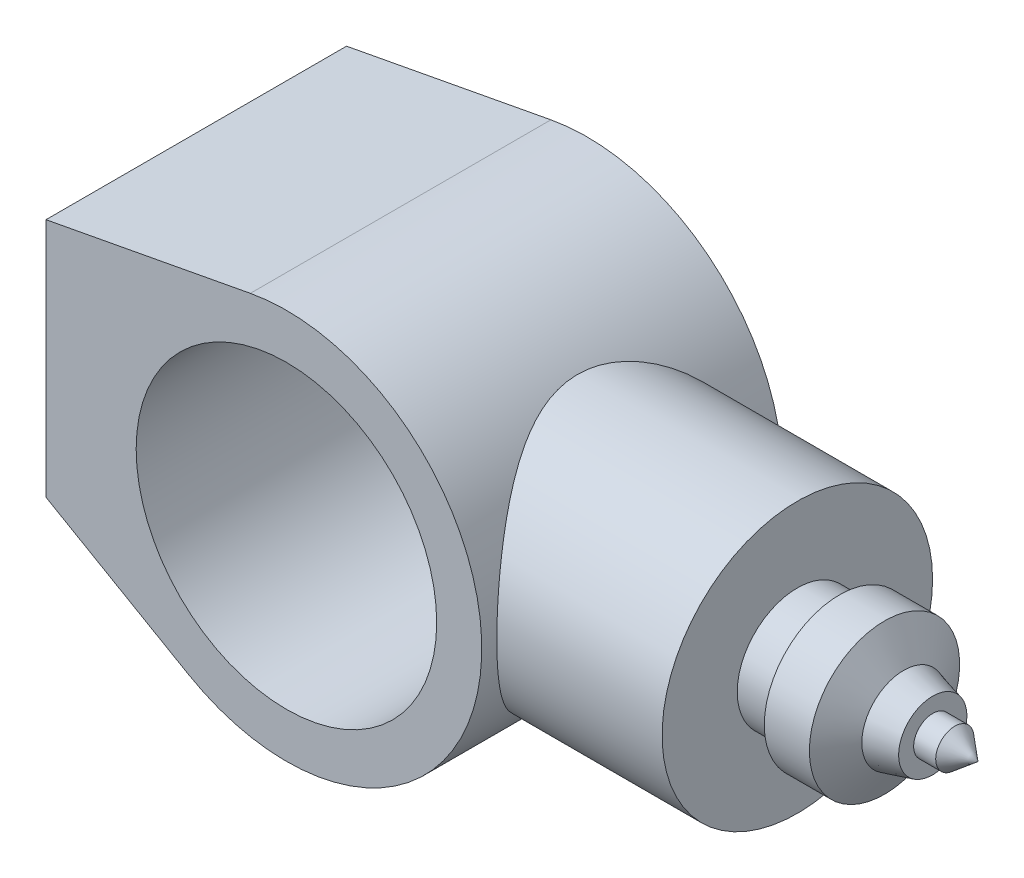
ISO-10303-21;
HEADER;
FILE_DESCRIPTION(('STEP AP214'),'2;1');
FILE_NAME('part.step','',(''),(''),'','','');
FILE_SCHEMA(('AUTOMOTIVE_DESIGN { 1 0 10303 214 1 1 1 1 }'));
ENDSEC;
DATA;
#1=APPLICATION_CONTEXT('core data for automotive mechanical design processes');
#2=APPLICATION_PROTOCOL_DEFINITION('international standard','automotive_design',2000,#1);
#3=PRODUCT_CONTEXT('',#1,'mechanical');
#4=PRODUCT('Part','Part','',(#3));
#5=PRODUCT_RELATED_PRODUCT_CATEGORY('part','',(#4));
#6=PRODUCT_DEFINITION_FORMATION('','',#4);
#7=PRODUCT_DEFINITION_CONTEXT('part definition',#1,'design');
#8=PRODUCT_DEFINITION('design','',#6,#7);
#9=PRODUCT_DEFINITION_SHAPE('','',#8);
#10=(LENGTH_UNIT() NAMED_UNIT(*) SI_UNIT(.MILLI.,.METRE.));
#11=(NAMED_UNIT(*) PLANE_ANGLE_UNIT() SI_UNIT($,.RADIAN.));
#12=(NAMED_UNIT(*) SI_UNIT($,.STERADIAN.) SOLID_ANGLE_UNIT());
#13=UNCERTAINTY_MEASURE_WITH_UNIT(LENGTH_MEASURE(1.E-05),#10,'distance_accuracy_value','');
#14=(GEOMETRIC_REPRESENTATION_CONTEXT(3) GLOBAL_UNCERTAINTY_ASSIGNED_CONTEXT((#13)) GLOBAL_UNIT_ASSIGNED_CONTEXT((#10,
#11,#12)) REPRESENTATION_CONTEXT('',''));
#15=CARTESIAN_POINT('',(0.,0.,0.));
#16=DIRECTION('',(0.,0.,1.));
#17=DIRECTION('',(1.,0.,0.));
#18=AXIS2_PLACEMENT_3D('',#15,#16,#17);
#19=CARTESIAN_POINT('',(0.,0.,50.));
#20=DIRECTION('',(0.,0.,1.));
#21=DIRECTION('',(1.,0.,0.));
#22=AXIS2_PLACEMENT_3D('',#19,#20,#21);
#23=PLANE('',#22);
#24=CARTESIAN_POINT('',(0.,0.,50.));
#25=DIRECTION('',(0.,0.,1.));
#26=DIRECTION('',(1.,0.,0.));
#27=AXIS2_PLACEMENT_3D('',#24,#25,#26);
#28=CIRCLE('',#27,65.);
#29=CARTESIAN_POINT('',(-32.4793847127573,-56.3035484554988,50.));
#30=VERTEX_POINT('',#29);
#31=CARTESIAN_POINT('',(-12.,63.8827050147378,50.));
#32=VERTEX_POINT('',#31);
#33=EDGE_CURVE('E207',#30,#32,#28,.T.);
#34=ORIENTED_EDGE('',*,*,#33,.T.);
#35=DIRECTION('',(-0.982810846380581,-0.184615384615384,0.));
#36=VECTOR('',#35,1.);
#37=CARTESIAN_POINT('',(-80.,51.1092947496003,50.));
#38=LINE('',#37,#36);
#39=CARTESIAN_POINT('',(-80.,51.1092947496003,50.));
#40=VERTEX_POINT('',#39);
#41=EDGE_CURVE('E89',#32,#40,#38,.T.);
#42=ORIENTED_EDGE('',*,*,#41,.T.);
#43=DIRECTION('',(0.,-1.,0.));
#44=VECTOR('',#43,1.);
#45=CARTESIAN_POINT('',(-80.,-28.8907052503997,50.));
#46=LINE('',#45,#44);
#47=CARTESIAN_POINT('',(-80.,-28.8907052503997,50.));
#48=VERTEX_POINT('',#47);
#49=EDGE_CURVE('E199',#40,#48,#46,.T.);
#50=ORIENTED_EDGE('',*,*,#49,.T.);
#51=DIRECTION('',(0.866208437776906,-0.499682841734728,0.));
#52=VECTOR('',#51,1.);
#53=CARTESIAN_POINT('',(-80.,-28.8907052503997,50.));
#54=LINE('',#53,#52);
#55=EDGE_CURVE('E58',#48,#30,#54,.T.);
#56=ORIENTED_EDGE('',*,*,#55,.T.);
#57=EDGE_LOOP('',(#34,#42,#50,#56));
#58=FACE_BOUND('',#57,.T.);
#59=CARTESIAN_POINT('',(0.,0.,50.));
#60=DIRECTION('',(0.,0.,1.));
#61=DIRECTION('',(1.,0.,0.));
#62=AXIS2_PLACEMENT_3D('',#59,#60,#61);
#63=CIRCLE('',#62,50.);
#64=CARTESIAN_POINT('',(50.,0.,50.));
#65=VERTEX_POINT('',#64);
#66=EDGE_CURVE('E130',#65,#65,#63,.T.);
#67=ORIENTED_EDGE('',*,*,#66,.F.);
#68=EDGE_LOOP('',(#67));
#69=FACE_BOUND('',#68,.T.);
#70=ADVANCED_FACE('F40',(#58,#69),#23,.T.);
#71=CARTESIAN_POINT('',(0.,0.,-50.));
#72=DIRECTION('',(0.,0.,1.));
#73=DIRECTION('',(1.,0.,0.));
#74=AXIS2_PLACEMENT_3D('',#71,#72,#73);
#75=PLANE('',#74);
#76=CARTESIAN_POINT('',(0.,0.,-50.));
#77=DIRECTION('',(0.,0.,1.));
#78=DIRECTION('',(1.,0.,0.));
#79=AXIS2_PLACEMENT_3D('',#76,#77,#78);
#80=CIRCLE('',#79,65.);
#81=CARTESIAN_POINT('',(-32.4793847127573,-56.3035484554988,-50.));
#82=VERTEX_POINT('',#81);
#83=CARTESIAN_POINT('',(-12.,63.8827050147378,-50.));
#84=VERTEX_POINT('',#83);
#85=EDGE_CURVE('E197',#82,#84,#80,.T.);
#86=ORIENTED_EDGE('',*,*,#85,.F.);
#87=DIRECTION('',(0.866208437776906,-0.499682841734728,0.));
#88=VECTOR('',#87,1.);
#89=CARTESIAN_POINT('',(-80.,-28.8907052503997,-50.));
#90=LINE('',#89,#88);
#91=CARTESIAN_POINT('',(-80.,-28.8907052503997,-50.));
#92=VERTEX_POINT('',#91);
#93=EDGE_CURVE('E82',#92,#82,#90,.T.);
#94=ORIENTED_EDGE('',*,*,#93,.F.);
#95=DIRECTION('',(0.,-1.,0.));
#96=VECTOR('',#95,1.);
#97=CARTESIAN_POINT('',(-80.,-28.8907052503997,-50.));
#98=LINE('',#97,#96);
#99=CARTESIAN_POINT('',(-80.,51.1092947496003,-50.));
#100=VERTEX_POINT('',#99);
#101=EDGE_CURVE('E76',#100,#92,#98,.T.);
#102=ORIENTED_EDGE('',*,*,#101,.F.);
#103=DIRECTION('',(-0.982810846380581,-0.184615384615384,0.));
#104=VECTOR('',#103,1.);
#105=CARTESIAN_POINT('',(-80.,51.1092947496003,-50.));
#106=LINE('',#105,#104);
#107=EDGE_CURVE('E191',#84,#100,#106,.T.);
#108=ORIENTED_EDGE('',*,*,#107,.F.);
#109=EDGE_LOOP('',(#86,#94,#102,#108));
#110=FACE_BOUND('',#109,.T.);
#111=CARTESIAN_POINT('',(0.,0.,-50.));
#112=DIRECTION('',(0.,0.,1.));
#113=DIRECTION('',(1.,0.,0.));
#114=AXIS2_PLACEMENT_3D('',#111,#112,#113);
#115=CIRCLE('',#114,50.);
#116=CARTESIAN_POINT('',(50.,0.,-50.));
#117=VERTEX_POINT('',#116);
#118=EDGE_CURVE('E121',#117,#117,#115,.T.);
#119=ORIENTED_EDGE('',*,*,#118,.T.);
#120=EDGE_LOOP('',(#119));
#121=FACE_BOUND('',#120,.T.);
#122=ADVANCED_FACE('F171',(#110,#121),#75,.F.);
#123=CARTESIAN_POINT('',(0.,0.,50.));
#124=DIRECTION('',(0.,0.,-1.));
#125=DIRECTION('',(-1.,0.,0.));
#126=AXIS2_PLACEMENT_3D('',#123,#124,#125);
#127=CYLINDRICAL_SURFACE('',#126,65.);
#128=CARTESIAN_POINT('',(65.,0.,-45.));
#129=CARTESIAN_POINT('',(65.0000011696056,1.12147330120565,-45.0000012025283));
#130=CARTESIAN_POINT('',(64.9709159765212,2.24292945230778,-44.9580201602482));
#131=CARTESIAN_POINT('',(64.8553068641382,4.47658414079082,-44.790785609369));
#132=CARTESIAN_POINT('',(64.7687842573088,5.58878288911931,-44.6655340035371));
#133=CARTESIAN_POINT('',(64.5403785763001,7.79555151848628,-44.3336771879691));
#134=CARTESIAN_POINT('',(64.3984760503456,8.89011506447751,-44.1270433931238));
#135=CARTESIAN_POINT('',(64.0626457436965,11.0533096019768,-43.6354760134034));
#136=CARTESIAN_POINT('',(63.8687169569864,12.1219400915896,-43.3505409144375));
#137=CARTESIAN_POINT('',(63.4342222744662,14.2212125160505,-42.7078017297046));
#138=CARTESIAN_POINT('',(63.1938918545644,15.2520162370063,-42.3503651251477));
#139=CARTESIAN_POINT('',(62.6709259446924,17.2756280115286,-41.5659763086892));
#140=CARTESIAN_POINT('',(62.3882907364914,18.268436318107,-41.1390245597888));
#141=CARTESIAN_POINT('',(61.786108553932,20.2116697228795,-40.2199419970838));
#142=CARTESIAN_POINT('',(61.4665619062631,21.1620951960855,-39.7278117601444));
#143=CARTESIAN_POINT('',(60.7962171584065,23.0172309124315,-38.6825647509799));
#144=CARTESIAN_POINT('',(60.4454175300334,23.9219389167185,-38.1294449962195));
#145=CARTESIAN_POINT('',(59.6865648974474,25.7601880140228,-36.9151737617935));
#146=CARTESIAN_POINT('',(59.2761881540199,26.6893215363404,-36.2488040005491));
#147=CARTESIAN_POINT('',(58.4330275057249,28.4880338622967,-34.8529502059224));
#148=CARTESIAN_POINT('',(58.0002425478181,29.3576098626539,-34.1234632053608));
#149=CARTESIAN_POINT('',(57.1195111836477,31.0364486388513,-32.6040251352403));
#150=CARTESIAN_POINT('',(56.6715447181891,31.8456267033451,-31.8139921794122));
#151=CARTESIAN_POINT('',(55.7691986061138,33.4006700551814,-30.1773036556993));
#152=CARTESIAN_POINT('',(55.3148185876119,34.1465316534289,-29.3306447936721));
#153=CARTESIAN_POINT('',(54.3303114345595,35.6959084068904,-27.4326466159468));
#154=CARTESIAN_POINT('',(53.8005937511269,36.4872853280241,-26.3711450656526));
#155=CARTESIAN_POINT('',(52.7593327891933,37.9773509509911,-24.17604025639));
#156=CARTESIAN_POINT('',(52.2477941160227,38.6760162868262,-23.0424189272517));
#157=CARTESIAN_POINT('',(51.2608149265043,39.9749077721744,-20.7072341856928));
#158=CARTESIAN_POINT('',(50.7853275075273,40.5752630453964,-19.5057627267967));
#159=CARTESIAN_POINT('',(49.8892399163793,41.6721166930025,-17.036931864064));
#160=CARTESIAN_POINT('',(49.4686114171658,42.1686687478853,-15.7696069409943));
#161=CARTESIAN_POINT('',(48.8208029416879,42.9149535309565,-13.5723996352816));
#162=CARTESIAN_POINT('',(48.5738420263557,43.1936925213245,-12.6581208440976));
#163=CARTESIAN_POINT('',(48.1238801744123,43.6944569649788,-10.8035389223551));
#164=CARTESIAN_POINT('',(47.9208721021929,43.9164916250901,-9.8632400440742));
#165=CARTESIAN_POINT('',(47.5660754926547,44.3005296261305,-7.9625043866341));
#166=CARTESIAN_POINT('',(47.4142038087044,44.4626304606427,-7.00210302149488));
#167=CARTESIAN_POINT('',(47.1671263845177,44.7246555122386,-5.06554052628519));
#168=CARTESIAN_POINT('',(47.0719206259529,44.824579749433,-4.08937940131226));
#169=CARTESIAN_POINT('',(46.9418899090943,44.9607388198673,-2.12323648479672));
#170=CARTESIAN_POINT('',(46.9073939345417,44.9966266570423,-1.13320851844659));
#171=CARTESIAN_POINT('',(46.9013571135476,45.0029190462422,0.847248377093837));
#172=CARTESIAN_POINT('',(46.9298161498631,44.9733237202183,1.83767730553398));
#173=CARTESIAN_POINT('',(47.0484302849821,44.8492190899201,3.8112875242908));
#174=CARTESIAN_POINT('',(47.13862305521,44.7546701492421,4.7944640185066));
#175=CARTESIAN_POINT('',(47.3768313176079,44.5024241630868,6.74551496467455));
#176=CARTESIAN_POINT('',(47.5248480621437,44.3447257499009,7.71338908473168));
#177=CARTESIAN_POINT('',(47.862176427184,43.9803320764262,9.56919366964684));
#178=CARTESIAN_POINT('',(48.0484149088864,43.7772163066585,10.4583970625519));
#179=CARTESIAN_POINT('',(48.4609441046406,43.32010640119,12.2144143492181));
#180=CARTESIAN_POINT('',(48.6872496045114,43.0660934784814,13.0812198417583));
#181=CARTESIAN_POINT('',(49.1738509640383,42.5096331932465,14.7898225666927));
#182=CARTESIAN_POINT('',(49.4341648638834,42.2071601049958,15.6316062329481));
#183=CARTESIAN_POINT('',(49.9825182796335,41.5563350032135,17.2876417419013));
#184=CARTESIAN_POINT('',(50.2705534011696,41.2079902580444,18.1018979206949));
#185=CARTESIAN_POINT('',(51.0225431471344,40.2767822129268,20.1137766396802));
#186=CARTESIAN_POINT('',(51.5007434523328,39.6654891440572,21.2930273345177));
#187=CARTESIAN_POINT('',(52.4891158781477,38.348029920852,23.5833678403921));
#188=CARTESIAN_POINT('',(52.9993005340588,37.6418264436726,24.6944305853524));
#189=CARTESIAN_POINT('',(54.0361557973494,36.1376496350166,26.8476775780095));
#190=CARTESIAN_POINT('',(54.5628535785461,35.3395185623559,27.8897384505711));
#191=CARTESIAN_POINT('',(55.6171804467178,33.6558443419671,29.8998791095632));
#192=CARTESIAN_POINT('',(56.1448094104418,32.7703120184234,30.8679680307498));
#193=CARTESIAN_POINT('',(57.1932449701135,30.9045304086319,32.7363921475659));
#194=CARTESIAN_POINT('',(57.7139191350982,29.9233731295192,33.6358963165067));
#195=CARTESIAN_POINT('',(58.7296419536465,27.8771206485979,35.350355349792));
#196=CARTESIAN_POINT('',(59.2246882700661,26.8120178135979,36.1653025097018));
#197=CARTESIAN_POINT('',(60.1756566955639,24.6035209522421,37.7024332048813));
#198=CARTESIAN_POINT('',(60.6316475651595,23.4602711709794,38.4247809320632));
#199=CARTESIAN_POINT('',(61.4931891608211,21.0989507187335,39.7703323765769));
#200=CARTESIAN_POINT('',(61.898755017873,19.8809026570889,40.3935658507715));
#201=CARTESIAN_POINT('',(62.5646802947783,17.6549035875762,41.4059204565395));
#202=CARTESIAN_POINT('',(62.8372982548467,16.6602403417733,41.8163120535009));
#203=CARTESIAN_POINT('',(63.3397164077328,14.6345031625144,42.5675669112335));
#204=CARTESIAN_POINT('',(63.569522535998,13.603434299959,42.9084398107234));
#205=CARTESIAN_POINT('',(63.9815049902596,11.5110112910016,43.5164676119118));
#206=CARTESIAN_POINT('',(64.1637052650743,10.4496726714621,43.7836595836378));
#207=CARTESIAN_POINT('',(64.476639865795,8.30296993183373,44.2409869387356));
#208=CARTESIAN_POINT('',(64.6073730982257,7.21760530180255,44.431120684921));
#209=CARTESIAN_POINT('',(64.8147345736682,5.02649787175025,44.7321113931982));
#210=CARTESIAN_POINT('',(64.8911534961694,3.92069290489765,44.8426616714377));
#211=CARTESIAN_POINT('',(64.9872183357685,1.7014535077621,44.981563734156));
#212=CARTESIAN_POINT('',(65.0068642771873,0.588019080747718,45.0099155538474));
#213=CARTESIAN_POINT('',(64.9889001241945,-1.63741781931563,44.9839662509349));
#214=CARTESIAN_POINT('',(64.9512898349751,-2.74942028747964,44.929664847113));
#215=CARTESIAN_POINT('',(64.8197344180529,-4.96298947367599,44.7392747901952));
#216=CARTESIAN_POINT('',(64.7257910494465,-6.06455651648124,44.6031886909653));
#217=CARTESIAN_POINT('',(64.491175703309,-8.18254449212147,44.2620157992034));
#218=CARTESIAN_POINT('',(64.3536808680178,-9.20007959997772,44.0616107864454));
#219=CARTESIAN_POINT('',(64.0337856060907,-11.2121337136588,43.593061351668));
#220=CARTESIAN_POINT('',(63.8513873855499,-12.2066538475799,43.3249202574929));
#221=CARTESIAN_POINT('',(63.4451725249075,-14.1673074608522,42.7239854011605));
#222=CARTESIAN_POINT('',(63.2213525684632,-15.1334386601222,42.3911864622048));
#223=CARTESIAN_POINT('',(62.736336352677,-17.0327019487273,41.6643868113869));
#224=CARTESIAN_POINT('',(62.4751380044848,-17.965832190203,41.2703826790343));
#225=CARTESIAN_POINT('',(61.8990085085122,-19.8637431772395,40.3931275129008));
#226=CARTESIAN_POINT('',(61.58152095285,-20.8256806929253,39.9054081529014));
#227=CARTESIAN_POINT('',(60.9142086391395,-22.7035764997345,38.8677076181211));
#228=CARTESIAN_POINT('',(60.5643826081083,-23.6195329786528,38.3177239921568));
#229=CARTESIAN_POINT('',(59.8381347129401,-25.4032558353403,37.1592008079418));
#230=CARTESIAN_POINT('',(59.4616987975441,-26.270996314329,36.5506302507532));
#231=CARTESIAN_POINT('',(58.6884577670336,-27.9557544991496,35.2787474176625));
#232=CARTESIAN_POINT('',(58.2916515549571,-28.7727694681138,34.615432192531));
#233=CARTESIAN_POINT('',(57.4151711853793,-30.4889708749911,33.1199200847162));
#234=CARTESIAN_POINT('',(56.9328754552547,-31.3785212006928,32.2781812569548));
#235=CARTESIAN_POINT('',(55.9590893109094,-33.0839042215169,30.527835244559));
#236=CARTESIAN_POINT('',(55.4675975421249,-33.8997259516807,29.61921815009));
#237=CARTESIAN_POINT('',(54.4860350387396,-35.45586994741,27.7375714933993));
#238=CARTESIAN_POINT('',(53.9959654596117,-36.1961418986443,26.7644997080007));
#239=CARTESIAN_POINT('',(53.0294834997435,-37.5978502361011,24.7568233036382));
#240=CARTESIAN_POINT('',(52.553069328415,-38.2592969946585,23.7222268074149));
#241=CARTESIAN_POINT('',(51.679941347726,-39.4291013564639,21.7149007388747));
#242=CARTESIAN_POINT('',(51.2803372484816,-39.9463152685162,20.7485884228094));
#243=CARTESIAN_POINT('',(50.5123974548912,-40.9130636661729,18.7705314851886));
#244=CARTESIAN_POINT('',(50.1440619804653,-41.3625976757847,17.7587865441704));
#245=CARTESIAN_POINT('',(49.4504928922364,-42.1893301292689,15.693797265063));
#246=CARTESIAN_POINT('',(49.1251906412472,-42.566644202947,14.6406225749502));
#247=CARTESIAN_POINT('',(48.5290098021012,-43.2451098617227,12.4950157035289));
#248=CARTESIAN_POINT('',(48.2581179989952,-43.5462799449171,11.4025931307278));
#249=CARTESIAN_POINT('',(47.8271610412375,-44.018687486118,9.39216299943514));
#250=CARTESIAN_POINT('',(47.6558419905218,-44.2036946073207,8.47979353570423));
#251=CARTESIAN_POINT('',(47.3627606953031,-44.517583244497,6.6375758266825));
#252=CARTESIAN_POINT('',(47.2409923142224,-44.6464717105955,5.70772976070378));
#253=CARTESIAN_POINT('',(47.05166615705,-44.8459556683364,3.83718735816976));
#254=CARTESIAN_POINT('',(46.9840561376509,-44.9166073394188,2.89650236820519));
#255=CARTESIAN_POINT('',(46.9055698265682,-44.9985645522097,1.01014116515039));
#256=CARTESIAN_POINT('',(46.894694331428,-45.0098692606967,0.0644648821698225));
#257=CARTESIAN_POINT('',(46.9301408777118,-44.972908524549,-1.82506201386802));
#258=CARTESIAN_POINT('',(46.9764888551696,-44.9246160680299,-2.768911604742));
#259=CARTESIAN_POINT('',(47.1245232303033,-44.7693052695385,-4.64731891289862));
#260=CARTESIAN_POINT('',(47.226209296244,-44.6622872796082,-5.58187668584875));
#261=CARTESIAN_POINT('',(47.4811423262629,-44.3911660407895,-7.4366659860656));
#262=CARTESIAN_POINT('',(47.634452919394,-44.2269923369625,-8.35687836049677));
#263=CARTESIAN_POINT('',(47.9871889035597,-43.8440109221367,-10.1768310643422));
#264=CARTESIAN_POINT('',(48.1866204648689,-43.6251959006593,-11.0765686368372));
#265=CARTESIAN_POINT('',(48.6908782922366,-43.0625185245671,-13.116726178063));
#266=CARTESIAN_POINT('',(49.0093972350599,-42.7008255731353,-14.2488681052183));
#267=CARTESIAN_POINT('',(49.699554494161,-41.8955268796886,-16.4668795226373));
#268=CARTESIAN_POINT('',(50.0712093704162,-41.4518955887103,-17.5527344499461));
#269=CARTESIAN_POINT('',(50.8544123719762,-40.4872212981013,-19.6760329984318));
#270=CARTESIAN_POINT('',(51.2660067549033,-39.9660881554129,-20.7134183727638));
#271=CARTESIAN_POINT('',(52.116211879306,-38.8508952329155,-22.7363587217865));
#272=CARTESIAN_POINT('',(52.5548209260535,-38.2568400254561,-23.7219169406072));
#273=CARTESIAN_POINT('',(53.4579357785502,-36.9847423381263,-25.6613286822633));
#274=CARTESIAN_POINT('',(53.9228021101371,-36.3051118639051,-26.6139712103077));
#275=CARTESIAN_POINT('',(54.8583333343946,-34.8753950985048,-28.4617532840731));
#276=CARTESIAN_POINT('',(55.3289982185488,-34.1253089107937,-29.3568929142367));
#277=CARTESIAN_POINT('',(56.2664339133502,-32.5564691651912,-31.0876310121466));
#278=CARTESIAN_POINT('',(56.7332035093429,-31.7376950080829,-31.923211478402));
#279=CARTESIAN_POINT('',(57.6535165855435,-30.033481652025,-33.5315189390535));
#280=CARTESIAN_POINT('',(58.1070588196761,-29.1480362003111,-34.3042400240121));
#281=CARTESIAN_POINT('',(59.0635284336244,-27.1643113596245,-35.9022819462666));
#282=CARTESIAN_POINT('',(59.5626106290919,-26.054747286961,-36.7159606163356));
#283=CARTESIAN_POINT('',(60.5176757229357,-23.7521280348398,-38.2458641369291));
#284=CARTESIAN_POINT('',(60.9736519283073,-22.5590599397197,-38.962073861155));
#285=CARTESIAN_POINT('',(61.6149926579414,-20.7127348127311,-39.9558623322098));
#286=CARTESIAN_POINT('',(61.8215919655178,-20.088110583999,-40.2735888165198));
#287=CARTESIAN_POINT('',(62.2191547005856,-18.8206694867556,-40.8812436548858));
#288=CARTESIAN_POINT('',(62.4101203779565,-18.1778552539997,-41.1711760099034));
#289=CARTESIAN_POINT('',(62.7748527233683,-16.875283117665,-41.7219931318356));
#290=CARTESIAN_POINT('',(62.9486230408552,-16.2155288469421,-41.9828840638124));
#291=CARTESIAN_POINT('',(63.2775356475736,-14.8804011558234,-42.4744610119283));
#292=CARTESIAN_POINT('',(63.432679284421,-14.2050288695918,-42.7051492133045));
#293=CARTESIAN_POINT('',(63.80707219681,-12.4447010544915,-43.25974494481));
#294=CARTESIAN_POINT('',(64.0114184468014,-11.3490405228654,-43.5602757498286));
#295=CARTESIAN_POINT('',(64.3654191982087,-9.12991345978804,-44.0788276443961));
#296=CARTESIAN_POINT('',(64.5150820049425,-8.00645117856259,-44.2968612637911));
#297=CARTESIAN_POINT('',(64.7559993187061,-5.74082253729115,-44.6470112993716));
#298=CARTESIAN_POINT('',(64.847297757104,-4.59867091062177,-44.7791923387443));
#299=CARTESIAN_POINT('',(64.9692976296881,-2.30434018473199,-44.9556862638234));
#300=CARTESIAN_POINT('',(64.9999987983895,-1.15216104160191,-44.999998764566));
#301=CARTESIAN_POINT('',(65.,0.,-45.));
#302=B_SPLINE_CURVE_WITH_KNOTS('',3,(#128,#129,#130,#131,#132,#133,#134,#135,#136,#137,#138,
#139,#140,#141,#142,#143,#144,#145,#146,#147,#148,#149,#150,#151,#152,#153,#154,#155,#156,#157,
#158,#159,#160,#161,#162,#163,#164,#165,#166,#167,#168,#169,#170,#171,#172,#173,#174,#175,#176,
#177,#178,#179,#180,#181,#182,#183,#184,#185,#186,#187,#188,#189,#190,#191,#192,#193,#194,#195,
#196,#197,#198,#199,#200,#201,#202,#203,#204,#205,#206,#207,#208,#209,#210,#211,#212,#213,#214,
#215,#216,#217,#218,#219,#220,#221,#222,#223,#224,#225,#226,#227,#228,#229,#230,#231,#232,#233,
#234,#235,#236,#237,#238,#239,#240,#241,#242,#243,#244,#245,#246,#247,#248,#249,#250,#251,#252,
#253,#254,#255,#256,#257,#258,#259,#260,#261,#262,#263,#264,#265,#266,#267,#268,#269,#270,#271,
#272,#273,#274,#275,#276,#277,#278,#279,#280,#281,#282,#283,#284,#285,#286,#287,#288,#289,#290,
#291,#292,#293,#294,#295,#296,#297,#298,#299,#300,#301),.UNSPECIFIED.,.T.,.F.,(4,2,2,2,2,2,2,2,
2,2,2,2,2,2,2,2,2,2,2,2,2,2,2,2,2,2,2,2,2,2,2,2,2,2,2,2,2,2,2,2,2,2,2,2,2,2,2,2,2,2,2,2,2,2,2,2,
2,2,2,2,2,2,2,2,2,2,2,2,2,2,2,2,2,2,2,2,2,2,2,2,2,2,2,2,2,2,4),(0.,3.36323892794144,
6.72640100710137,10.0907454360665,13.4551549250109,16.8029195613731,20.1506619010729,
23.4983746134034,26.8462511096753,30.4871649037346,34.1282499524345,37.7743494260164,
41.4206611917409,45.6939383064405,49.9682903731881,54.2369825353392,58.5034617073671,
61.4625138492405,64.4210852373372,67.3748225577202,70.3285589227264,73.2982527376573,
76.2679410220408,79.2394430998938,82.2110095388412,85.0011411726389,87.7923045951578,
90.584954683776,93.3771628083065,97.6064034875675,101.837312178738,106.075592113262,
110.313347816192,114.596218662803,118.879479402292,123.155037051935,127.429308626693,
130.755998382163,134.082226580387,137.406778235214,140.731400520075,144.068767009318,
147.406132068879,150.743508483461,154.080780688207,157.215791533369,160.350648386749,
163.485756334407,166.621039552604,169.990545063149,173.360183268584,176.73161428665,
180.103227050672,184.047902440152,187.993163521895,191.94103513809,195.888386692538,
199.385185586645,202.88200907258,206.373186157811,209.863514294626,212.700365177753,
215.536864625513,218.370624567028,221.204424293963,224.039508887241,226.874576485218,
229.713151272815,232.55210603787,236.23803941247,239.925124033801,243.616531168718,
247.307706963636,251.081871120678,254.856029735251,258.631324277359,262.406973327354,
266.792058434818,271.177823293658,273.368885604935,275.55963203795,277.749912517597,
279.940034437727,283.398420446896,286.856280978073,290.31153567335,293.766805506531),.UNSPECIFIED.);
#303=CARTESIAN_POINT('',(65.,0.,-45.));
#304=VERTEX_POINT('',#303);
#305=EDGE_CURVE('E110',#304,#304,#302,.T.);
#306=ORIENTED_EDGE('',*,*,#305,.F.);
#307=EDGE_LOOP('',(#306));
#308=FACE_BOUND('',#307,.T.);
#309=ORIENTED_EDGE('',*,*,#85,.T.);
#310=DIRECTION('',(0.,0.,-1.));
#311=VECTOR('',#310,1.);
#312=CARTESIAN_POINT('',(-12.,63.8827050147378,50.));
#313=LINE('',#312,#311);
#314=EDGE_CURVE('E11',#32,#84,#313,.T.);
#315=ORIENTED_EDGE('',*,*,#314,.F.);
#316=ORIENTED_EDGE('',*,*,#33,.F.);
#317=DIRECTION('',(0.,0.,-1.));
#318=VECTOR('',#317,1.);
#319=CARTESIAN_POINT('',(-32.4793847127573,-56.3035484554988,50.));
#320=LINE('',#319,#318);
#321=EDGE_CURVE('E211',#30,#82,#320,.T.);
#322=ORIENTED_EDGE('',*,*,#321,.T.);
#323=EDGE_LOOP('',(#309,#315,#316,#322));
#324=FACE_BOUND('',#323,.T.);
#325=ADVANCED_FACE('F42',(#308,#324),#127,.T.);
#326=CARTESIAN_POINT('',(-80.,51.1092947496003,50.));
#327=DIRECTION('',(0.184615384615384,-0.982810846380581,0.));
#328=DIRECTION('',(0.982810846380581,0.184615384615384,0.));
#329=AXIS2_PLACEMENT_3D('',#326,#327,#328);
#330=PLANE('',#329);
#331=ORIENTED_EDGE('',*,*,#107,.T.);
#332=DIRECTION('',(0.,0.,-1.));
#333=VECTOR('',#332,1.);
#334=CARTESIAN_POINT('',(-80.,51.1092947496003,50.));
#335=LINE('',#334,#333);
#336=EDGE_CURVE('E50',#40,#100,#335,.T.);
#337=ORIENTED_EDGE('',*,*,#336,.F.);
#338=ORIENTED_EDGE('',*,*,#41,.F.);
#339=ORIENTED_EDGE('',*,*,#314,.T.);
#340=EDGE_LOOP('',(#331,#337,#338,#339));
#341=FACE_BOUND('',#340,.T.);
#342=ADVANCED_FACE('F185',(#341),#330,.F.);
#343=CARTESIAN_POINT('',(-80.,-28.8907052503997,50.));
#344=DIRECTION('',(1.,0.,0.));
#345=DIRECTION('',(0.,1.,0.));
#346=AXIS2_PLACEMENT_3D('',#343,#344,#345);
#347=PLANE('',#346);
#348=ORIENTED_EDGE('',*,*,#101,.T.);
#349=DIRECTION('',(0.,0.,-1.));
#350=VECTOR('',#349,1.);
#351=CARTESIAN_POINT('',(-80.,-28.8907052503997,50.));
#352=LINE('',#351,#350);
#353=EDGE_CURVE('E201',#48,#92,#352,.T.);
#354=ORIENTED_EDGE('',*,*,#353,.F.);
#355=ORIENTED_EDGE('',*,*,#49,.F.);
#356=ORIENTED_EDGE('',*,*,#336,.T.);
#357=EDGE_LOOP('',(#348,#354,#355,#356));
#358=FACE_BOUND('',#357,.T.);
#359=ADVANCED_FACE('F183',(#358),#347,.F.);
#360=CARTESIAN_POINT('',(-80.,-28.8907052503997,50.));
#361=DIRECTION('',(0.499682841734728,0.866208437776905,0.));
#362=DIRECTION('',(-0.866208437776905,0.499682841734728,0.));
#363=AXIS2_PLACEMENT_3D('',#360,#361,#362);
#364=PLANE('',#363);
#365=ORIENTED_EDGE('',*,*,#93,.T.);
#366=ORIENTED_EDGE('',*,*,#321,.F.);
#367=ORIENTED_EDGE('',*,*,#55,.F.);
#368=ORIENTED_EDGE('',*,*,#353,.T.);
#369=EDGE_LOOP('',(#365,#366,#367,#368));
#370=FACE_BOUND('',#369,.T.);
#371=ADVANCED_FACE('F180',(#370),#364,.F.);
#372=CARTESIAN_POINT('',(0.,0.,50.));
#373=DIRECTION('',(0.,0.,-1.));
#374=DIRECTION('',(-1.,0.,0.));
#375=AXIS2_PLACEMENT_3D('',#372,#373,#374);
#376=CYLINDRICAL_SURFACE('',#375,50.);
#377=ORIENTED_EDGE('',*,*,#66,.T.);
#378=EDGE_LOOP('',(#377));
#379=FACE_BOUND('',#378,.T.);
#380=ORIENTED_EDGE('',*,*,#118,.F.);
#381=EDGE_LOOP('',(#380));
#382=FACE_BOUND('',#381,.T.);
#383=ADVANCED_FACE('F140',(#379,#382),#376,.F.);
#384=CARTESIAN_POINT('',(120.,0.,0.));
#385=DIRECTION('',(1.,0.,0.));
#386=DIRECTION('',(0.,0.,-1.));
#387=AXIS2_PLACEMENT_3D('',#384,#385,#386);
#388=PLANE('',#387);
#389=CARTESIAN_POINT('',(120.,0.,0.));
#390=DIRECTION('',(-1.,0.,0.));
#391=DIRECTION('',(0.,0.,1.));
#392=AXIS2_PLACEMENT_3D('',#389,#390,#391);
#393=CIRCLE('',#392,20.);
#394=CARTESIAN_POINT('',(120.,0.,20.));
#395=VERTEX_POINT('',#394);
#396=EDGE_CURVE('E105',#395,#395,#393,.T.);
#397=ORIENTED_EDGE('',*,*,#396,.T.);
#398=EDGE_LOOP('',(#397));
#399=FACE_BOUND('',#398,.T.);
#400=CARTESIAN_POINT('',(120.,0.,0.));
#401=DIRECTION('',(1.,0.,0.));
#402=DIRECTION('',(0.,0.,-1.));
#403=AXIS2_PLACEMENT_3D('',#400,#401,#402);
#404=CIRCLE('',#403,45.);
#405=CARTESIAN_POINT('',(120.,0.,-45.));
#406=VERTEX_POINT('',#405);
#407=EDGE_CURVE('E117',#406,#406,#404,.T.);
#408=ORIENTED_EDGE('',*,*,#407,.T.);
#409=EDGE_LOOP('',(#408));
#410=FACE_BOUND('',#409,.T.);
#411=ADVANCED_FACE('F137',(#399,#410),#388,.T.);
#412=CARTESIAN_POINT('',(-80.002,0.,0.));
#413=DIRECTION('',(1.,0.,0.));
#414=DIRECTION('',(0.,0.,-1.));
#415=AXIS2_PLACEMENT_3D('',#412,#413,#414);
#416=CYLINDRICAL_SURFACE('',#415,45.);
#417=ORIENTED_EDGE('',*,*,#407,.F.);
#418=EDGE_LOOP('',(#417));
#419=FACE_BOUND('',#418,.T.);
#420=ORIENTED_EDGE('',*,*,#305,.T.);
#421=EDGE_LOOP('',(#420));
#422=FACE_BOUND('',#421,.T.);
#423=ADVANCED_FACE('F132',(#419,#422),#416,.T.);
#424=CARTESIAN_POINT('',(165.045132910414,9.16184533297302E-13,0.));
#425=DIRECTION('',(1.,0.,0.));
#426=DIRECTION('',(0.,0.,-1.));
#427=AXIS2_PLACEMENT_3D('',#424,#425,#426);
#428=PLANE('',#427);
#429=CARTESIAN_POINT('',(165.045132910414,0.,0.));
#430=DIRECTION('',(-1.,0.,0.));
#431=DIRECTION('',(0.,0.,1.));
#432=AXIS2_PLACEMENT_3D('',#429,#430,#431);
#433=CIRCLE('',#432,6.35115020869847);
#434=CARTESIAN_POINT('',(165.045132910414,0.,6.35115020869847));
#435=VERTEX_POINT('',#434);
#436=EDGE_CURVE('E104',#435,#435,#433,.T.);
#437=ORIENTED_EDGE('',*,*,#436,.T.);
#438=EDGE_LOOP('',(#437));
#439=FACE_BOUND('',#438,.T.);
#440=CARTESIAN_POINT('',(165.045132910414,0.,0.));
#441=DIRECTION('',(-1.,0.,0.));
#442=DIRECTION('',(0.,0.,1.));
#443=AXIS2_PLACEMENT_3D('',#440,#441,#442);
#444=CIRCLE('',#443,11.3511502086984);
#445=CARTESIAN_POINT('',(165.045132910414,0.,11.3511502086984));
#446=VERTEX_POINT('',#445);
#447=EDGE_CURVE('E235',#446,#446,#444,.T.);
#448=ORIENTED_EDGE('',*,*,#447,.F.);
#449=EDGE_LOOP('',(#448));
#450=FACE_BOUND('',#449,.T.);
#451=ADVANCED_FACE('F142',(#439,#450),#428,.T.);
#452=CARTESIAN_POINT('',(0.,0.,0.));
#453=DIRECTION('',(-1.,0.,0.));
#454=DIRECTION('',(0.,0.,1.));
#455=AXIS2_PLACEMENT_3D('',#452,#453,#454);
#456=CYLINDRICAL_SURFACE('',#455,6.35115020869858);
#457=CARTESIAN_POINT('',(172.385328122731,0.,0.));
#458=DIRECTION('',(-1.,0.,0.));
#459=DIRECTION('',(0.,0.,1.));
#460=AXIS2_PLACEMENT_3D('',#457,#458,#459);
#461=CIRCLE('',#460,6.35115020869869);
#462=CARTESIAN_POINT('',(172.385328122731,0.,6.35115020869869));
#463=VERTEX_POINT('',#462);
#464=EDGE_CURVE('E101',#463,#463,#461,.T.);
#465=ORIENTED_EDGE('',*,*,#464,.T.);
#466=EDGE_LOOP('',(#465));
#467=FACE_BOUND('',#466,.T.);
#468=ORIENTED_EDGE('',*,*,#436,.F.);
#469=EDGE_LOOP('',(#468));
#470=FACE_BOUND('',#469,.T.);
#471=ADVANCED_FACE('F97',(#467,#470),#456,.T.);
#472=CARTESIAN_POINT('',(172.385328122731,0.,0.));
#473=DIRECTION('',(-1.,0.,0.));
#474=DIRECTION('',(0.,0.,1.));
#475=AXIS2_PLACEMENT_3D('',#472,#473,#474);
#476=CONICAL_SURFACE('',#475,6.35115020869869,0.688157421139026);
#477=CARTESIAN_POINT('',(180.109503873356,0.,0.));
#478=VERTEX_POINT('',#477);
#479=VERTEX_LOOP('',#478);
#480=FACE_BOUND('',#479,.T.);
#481=ORIENTED_EDGE('',*,*,#464,.F.);
#482=EDGE_LOOP('',(#481));
#483=FACE_BOUND('',#482,.T.);
#484=ADVANCED_FACE('F93',(#480,#483),#476,.T.);
#485=CARTESIAN_POINT('',(0.,0.,0.));
#486=DIRECTION('',(-1.,0.,0.));
#487=DIRECTION('',(0.,0.,1.));
#488=AXIS2_PLACEMENT_3D('',#485,#486,#487);
#489=CYLINDRICAL_SURFACE('',#488,20.);
#490=CARTESIAN_POINT('',(134.,0.,0.));
#491=DIRECTION('',(-1.,0.,0.));
#492=DIRECTION('',(0.,0.,1.));
#493=AXIS2_PLACEMENT_3D('',#490,#491,#492);
#494=CIRCLE('',#493,20.);
#495=CARTESIAN_POINT('',(134.,0.,20.));
#496=VERTEX_POINT('',#495);
#497=EDGE_CURVE('E113',#496,#496,#494,.T.);
#498=ORIENTED_EDGE('',*,*,#497,.T.);
#499=EDGE_LOOP('',(#498));
#500=FACE_BOUND('',#499,.T.);
#501=ORIENTED_EDGE('',*,*,#396,.F.);
#502=EDGE_LOOP('',(#501));
#503=FACE_BOUND('',#502,.T.);
#504=ADVANCED_FACE('F96',(#500,#503),#489,.T.);
#505=CARTESIAN_POINT('',(134.,0.,0.));
#506=DIRECTION('',(-1.,0.,0.));
#507=DIRECTION('',(0.,0.,1.));
#508=AXIS2_PLACEMENT_3D('',#505,#506,#507);
#509=PLANE('',#508);
#510=CARTESIAN_POINT('',(134.,0.,0.));
#511=DIRECTION('',(-1.,0.,0.));
#512=DIRECTION('',(0.,0.,1.));
#513=AXIS2_PLACEMENT_3D('',#510,#511,#512);
#514=CIRCLE('',#513,25.);
#515=CARTESIAN_POINT('',(134.,0.,25.));
#516=VERTEX_POINT('',#515);
#517=EDGE_CURVE('E245',#516,#516,#514,.T.);
#518=ORIENTED_EDGE('',*,*,#517,.T.);
#519=EDGE_LOOP('',(#518));
#520=FACE_BOUND('',#519,.T.);
#521=ORIENTED_EDGE('',*,*,#497,.F.);
#522=EDGE_LOOP('',(#521));
#523=FACE_BOUND('',#522,.T.);
#524=ADVANCED_FACE('F150',(#520,#523),#509,.T.);
#525=CARTESIAN_POINT('',(0.,0.,0.));
#526=DIRECTION('',(-1.,0.,0.));
#527=DIRECTION('',(0.,0.,1.));
#528=AXIS2_PLACEMENT_3D('',#525,#526,#527);
#529=CYLINDRICAL_SURFACE('',#528,25.);
#530=CARTESIAN_POINT('',(149.,0.,0.));
#531=DIRECTION('',(-1.,0.,0.));
#532=DIRECTION('',(0.,0.,1.));
#533=AXIS2_PLACEMENT_3D('',#530,#531,#532);
#534=CIRCLE('',#533,25.);
#535=CARTESIAN_POINT('',(149.,0.,25.));
#536=VERTEX_POINT('',#535);
#537=EDGE_CURVE('E240',#536,#536,#534,.T.);
#538=ORIENTED_EDGE('',*,*,#537,.T.);
#539=EDGE_LOOP('',(#538));
#540=FACE_BOUND('',#539,.T.);
#541=ORIENTED_EDGE('',*,*,#517,.F.);
#542=EDGE_LOOP('',(#541));
#543=FACE_BOUND('',#542,.T.);
#544=ADVANCED_FACE('F154',(#540,#543),#529,.T.);
#545=CARTESIAN_POINT('',(149.,0.,0.));
#546=DIRECTION('',(-1.,0.,0.));
#547=DIRECTION('',(0.,0.,1.));
#548=AXIS2_PLACEMENT_3D('',#545,#546,#547);
#549=CONICAL_SURFACE('',#548,25.,1.0471975511966);
#550=CARTESIAN_POINT('',(155.385874647523,0.,0.));
#551=DIRECTION('',(-1.,0.,0.));
#552=DIRECTION('',(0.,0.,1.));
#553=AXIS2_PLACEMENT_3D('',#550,#551,#552);
#554=CIRCLE('',#553,13.9393406597239);
#555=CARTESIAN_POINT('',(155.385874647523,0.,13.9393406597239));
#556=VERTEX_POINT('',#555);
#557=EDGE_CURVE('E236',#556,#556,#554,.T.);
#558=ORIENTED_EDGE('',*,*,#557,.T.);
#559=EDGE_LOOP('',(#558));
#560=FACE_BOUND('',#559,.T.);
#561=ORIENTED_EDGE('',*,*,#537,.F.);
#562=EDGE_LOOP('',(#561));
#563=FACE_BOUND('',#562,.T.);
#564=ADVANCED_FACE('F158',(#560,#563),#549,.T.);
#565=CARTESIAN_POINT('',(155.385874647523,0.,0.));
#566=DIRECTION('',(-1.,0.,0.));
#567=DIRECTION('',(0.,0.,1.));
#568=AXIS2_PLACEMENT_3D('',#565,#566,#567);
#569=CONICAL_SURFACE('',#568,13.9393406597239,0.26179938779918);
#570=ORIENTED_EDGE('',*,*,#447,.T.);
#571=EDGE_LOOP('',(#570));
#572=FACE_BOUND('',#571,.T.);
#573=ORIENTED_EDGE('',*,*,#557,.F.);
#574=EDGE_LOOP('',(#573));
#575=FACE_BOUND('',#574,.T.);
#576=ADVANCED_FACE('F162',(#572,#575),#569,.T.);
#577=CLOSED_SHELL('',(#70,#122,#325,#342,#359,#371,#383,#411,#423,#451,#471,#484,#504,#524,#544,
#564,#576));
#578=MANIFOLD_SOLID_BREP('B2',#577);
#579=ADVANCED_BREP_SHAPE_REPRESENTATION('',(#18,#578),#14);
#580=SHAPE_DEFINITION_REPRESENTATION(#9,#579);
ENDSEC;
END-ISO-10303-21;
